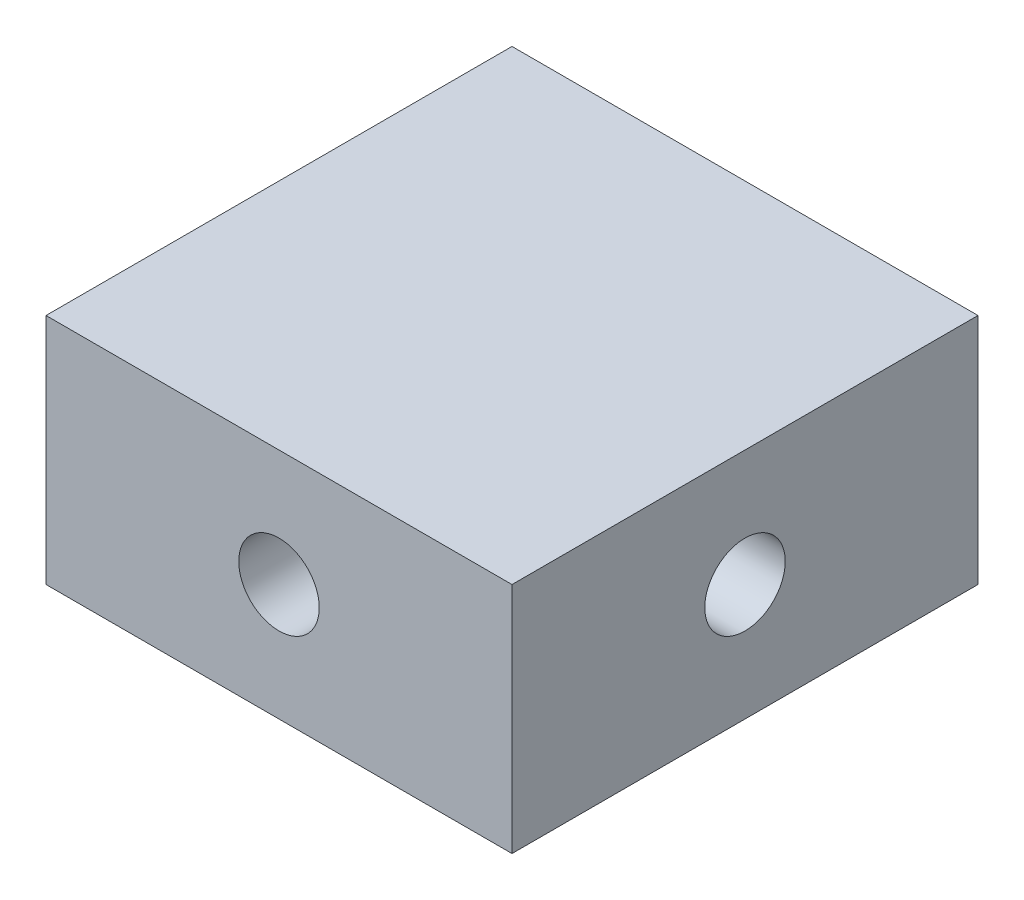
ISO-10303-21;
HEADER;
FILE_DESCRIPTION(('STEP AP214'),'2;1');
FILE_NAME('part.step','',(''),(''),'','','');
FILE_SCHEMA(('AUTOMOTIVE_DESIGN { 1 0 10303 214 1 1 1 1 }'));
ENDSEC;
DATA;
#1=APPLICATION_CONTEXT('core data for automotive mechanical design processes');
#2=APPLICATION_PROTOCOL_DEFINITION('international standard','automotive_design',2000,#1);
#3=PRODUCT_CONTEXT('',#1,'mechanical');
#4=PRODUCT('Part','Part','',(#3));
#5=PRODUCT_RELATED_PRODUCT_CATEGORY('part','',(#4));
#6=PRODUCT_DEFINITION_FORMATION('','',#4);
#7=PRODUCT_DEFINITION_CONTEXT('part definition',#1,'design');
#8=PRODUCT_DEFINITION('design','',#6,#7);
#9=PRODUCT_DEFINITION_SHAPE('','',#8);
#10=(LENGTH_UNIT() NAMED_UNIT(*) SI_UNIT(.MILLI.,.METRE.));
#11=(NAMED_UNIT(*) PLANE_ANGLE_UNIT() SI_UNIT($,.RADIAN.));
#12=(NAMED_UNIT(*) SI_UNIT($,.STERADIAN.) SOLID_ANGLE_UNIT());
#13=UNCERTAINTY_MEASURE_WITH_UNIT(LENGTH_MEASURE(1.E-05),#10,'distance_accuracy_value','');
#14=(GEOMETRIC_REPRESENTATION_CONTEXT(3) GLOBAL_UNCERTAINTY_ASSIGNED_CONTEXT((#13)) GLOBAL_UNIT_ASSIGNED_CONTEXT((#10,
#11,#12)) REPRESENTATION_CONTEXT('',''));
#15=CARTESIAN_POINT('',(0.,0.,0.));
#16=DIRECTION('',(0.,0.,1.));
#17=DIRECTION('',(1.,0.,0.));
#18=AXIS2_PLACEMENT_3D('',#15,#16,#17);
#19=CARTESIAN_POINT('',(0.,5.,10.));
#20=DIRECTION('',(0.,0.,-1.));
#21=DIRECTION('',(-1.,0.,0.));
#22=AXIS2_PLACEMENT_3D('',#19,#20,#21);
#23=PLANE('',#22);
#24=CARTESIAN_POINT('',(1.04744440165294E-13,0.,10.));
#25=DIRECTION('',(0.,0.,1.));
#26=DIRECTION('',(1.,0.,0.));
#27=AXIS2_PLACEMENT_3D('',#24,#25,#26);
#28=CIRCLE('',#27,1.7272);
#29=CARTESIAN_POINT('',(1.7272000000001,0.,10.));
#30=VERTEX_POINT('',#29);
#31=EDGE_CURVE('E124',#30,#30,#28,.T.);
#32=ORIENTED_EDGE('',*,*,#31,.F.);
#33=EDGE_LOOP('',(#32));
#34=FACE_BOUND('',#33,.T.);
#35=DIRECTION('',(1.,0.,0.));
#36=VECTOR('',#35,1.);
#37=CARTESIAN_POINT('',(0.,-5.,10.));
#38=LINE('',#37,#36);
#39=CARTESIAN_POINT('',(-10.,-5.,10.));
#40=VERTEX_POINT('',#39);
#41=CARTESIAN_POINT('',(10.,-5.,10.));
#42=VERTEX_POINT('',#41);
#43=EDGE_CURVE('E154',#40,#42,#38,.T.);
#44=ORIENTED_EDGE('',*,*,#43,.T.);
#45=DIRECTION('',(0.,-1.,0.));
#46=VECTOR('',#45,1.);
#47=CARTESIAN_POINT('',(10.,5.,10.));
#48=LINE('',#47,#46);
#49=CARTESIAN_POINT('',(10.,5.,10.));
#50=VERTEX_POINT('',#49);
#51=EDGE_CURVE('E11',#50,#42,#48,.T.);
#52=ORIENTED_EDGE('',*,*,#51,.F.);
#53=DIRECTION('',(1.,0.,0.));
#54=VECTOR('',#53,1.);
#55=CARTESIAN_POINT('',(0.,5.,10.));
#56=LINE('',#55,#54);
#57=CARTESIAN_POINT('',(-10.,5.,10.));
#58=VERTEX_POINT('',#57);
#59=EDGE_CURVE('E155',#58,#50,#56,.T.);
#60=ORIENTED_EDGE('',*,*,#59,.F.);
#61=DIRECTION('',(0.,-1.,0.));
#62=VECTOR('',#61,1.);
#63=CARTESIAN_POINT('',(-10.,5.,10.));
#64=LINE('',#63,#62);
#65=EDGE_CURVE('E64',#58,#40,#64,.T.);
#66=ORIENTED_EDGE('',*,*,#65,.T.);
#67=EDGE_LOOP('',(#44,#52,#60,#66));
#68=FACE_BOUND('',#67,.T.);
#69=ADVANCED_FACE('F44',(#34,#68),#23,.F.);
#70=CARTESIAN_POINT('',(10.,5.,0.));
#71=DIRECTION('',(-1.,0.,0.));
#72=DIRECTION('',(0.,0.,1.));
#73=AXIS2_PLACEMENT_3D('',#70,#71,#72);
#74=PLANE('',#73);
#75=CARTESIAN_POINT('',(10.,0.,0.));
#76=DIRECTION('',(1.,0.,0.));
#77=DIRECTION('',(0.,0.,-1.));
#78=AXIS2_PLACEMENT_3D('',#75,#76,#77);
#79=CIRCLE('',#78,1.7272);
#80=CARTESIAN_POINT('',(10.,0.,-1.7272));
#81=VERTEX_POINT('',#80);
#82=EDGE_CURVE('E146',#81,#81,#79,.T.);
#83=ORIENTED_EDGE('',*,*,#82,.F.);
#84=EDGE_LOOP('',(#83));
#85=FACE_BOUND('',#84,.T.);
#86=DIRECTION('',(0.,0.,-1.));
#87=VECTOR('',#86,1.);
#88=CARTESIAN_POINT('',(10.,-5.,0.));
#89=LINE('',#88,#87);
#90=CARTESIAN_POINT('',(10.,-5.,-10.));
#91=VERTEX_POINT('',#90);
#92=EDGE_CURVE('E169',#42,#91,#89,.T.);
#93=ORIENTED_EDGE('',*,*,#92,.T.);
#94=DIRECTION('',(0.,-1.,0.));
#95=VECTOR('',#94,1.);
#96=CARTESIAN_POINT('',(10.,5.,-10.));
#97=LINE('',#96,#95);
#98=CARTESIAN_POINT('',(10.,5.,-10.));
#99=VERTEX_POINT('',#98);
#100=EDGE_CURVE('E53',#99,#91,#97,.T.);
#101=ORIENTED_EDGE('',*,*,#100,.F.);
#102=DIRECTION('',(0.,0.,-1.));
#103=VECTOR('',#102,1.);
#104=CARTESIAN_POINT('',(10.,5.,0.));
#105=LINE('',#104,#103);
#106=EDGE_CURVE('E95',#50,#99,#105,.T.);
#107=ORIENTED_EDGE('',*,*,#106,.F.);
#108=ORIENTED_EDGE('',*,*,#51,.T.);
#109=EDGE_LOOP('',(#93,#101,#107,#108));
#110=FACE_BOUND('',#109,.T.);
#111=ADVANCED_FACE('F187',(#85,#110),#74,.F.);
#112=CARTESIAN_POINT('',(0.,5.,-10.));
#113=DIRECTION('',(0.,0.,-1.));
#114=DIRECTION('',(-1.,0.,0.));
#115=AXIS2_PLACEMENT_3D('',#112,#113,#114);
#116=PLANE('',#115);
#117=CARTESIAN_POINT('',(0.,0.,-10.));
#118=DIRECTION('',(0.,0.,-1.));
#119=DIRECTION('',(-1.,0.,0.));
#120=AXIS2_PLACEMENT_3D('',#117,#118,#119);
#121=CIRCLE('',#120,1.7272);
#122=CARTESIAN_POINT('',(-1.72720000000003,0.,-10.));
#123=VERTEX_POINT('',#122);
#124=EDGE_CURVE('E138',#123,#123,#121,.T.);
#125=ORIENTED_EDGE('',*,*,#124,.F.);
#126=EDGE_LOOP('',(#125));
#127=FACE_BOUND('',#126,.T.);
#128=DIRECTION('',(1.,0.,0.));
#129=VECTOR('',#128,1.);
#130=CARTESIAN_POINT('',(0.,-5.,-10.));
#131=LINE('',#130,#129);
#132=CARTESIAN_POINT('',(-10.,-5.,-10.));
#133=VERTEX_POINT('',#132);
#134=EDGE_CURVE('E173',#133,#91,#131,.T.);
#135=ORIENTED_EDGE('',*,*,#134,.F.);
#136=DIRECTION('',(0.,-1.,0.));
#137=VECTOR('',#136,1.);
#138=CARTESIAN_POINT('',(-10.,5.,-10.));
#139=LINE('',#138,#137);
#140=CARTESIAN_POINT('',(-10.,5.,-10.));
#141=VERTEX_POINT('',#140);
#142=EDGE_CURVE('E84',#141,#133,#139,.T.);
#143=ORIENTED_EDGE('',*,*,#142,.F.);
#144=DIRECTION('',(1.,0.,0.));
#145=VECTOR('',#144,1.);
#146=CARTESIAN_POINT('',(0.,5.,-10.));
#147=LINE('',#146,#145);
#148=EDGE_CURVE('E161',#141,#99,#147,.T.);
#149=ORIENTED_EDGE('',*,*,#148,.T.);
#150=ORIENTED_EDGE('',*,*,#100,.T.);
#151=EDGE_LOOP('',(#135,#143,#149,#150));
#152=FACE_BOUND('',#151,.T.);
#153=ADVANCED_FACE('F185',(#127,#152),#116,.T.);
#154=CARTESIAN_POINT('',(-10.,5.,0.));
#155=DIRECTION('',(-1.,0.,0.));
#156=DIRECTION('',(0.,0.,1.));
#157=AXIS2_PLACEMENT_3D('',#154,#155,#156);
#158=PLANE('',#157);
#159=CARTESIAN_POINT('',(-10.,0.,0.));
#160=DIRECTION('',(-1.,0.,0.));
#161=DIRECTION('',(0.,0.,1.));
#162=AXIS2_PLACEMENT_3D('',#159,#160,#161);
#163=CIRCLE('',#162,1.7272);
#164=CARTESIAN_POINT('',(-10.,0.,1.7272));
#165=VERTEX_POINT('',#164);
#166=EDGE_CURVE('E123',#165,#165,#163,.T.);
#167=ORIENTED_EDGE('',*,*,#166,.F.);
#168=EDGE_LOOP('',(#167));
#169=FACE_BOUND('',#168,.T.);
#170=DIRECTION('',(0.,0.,-1.));
#171=VECTOR('',#170,1.);
#172=CARTESIAN_POINT('',(-10.,-5.,0.));
#173=LINE('',#172,#171);
#174=EDGE_CURVE('E158',#40,#133,#173,.T.);
#175=ORIENTED_EDGE('',*,*,#174,.F.);
#176=ORIENTED_EDGE('',*,*,#65,.F.);
#177=DIRECTION('',(0.,0.,-1.));
#178=VECTOR('',#177,1.);
#179=CARTESIAN_POINT('',(-10.,5.,0.));
#180=LINE('',#179,#178);
#181=EDGE_CURVE('E165',#58,#141,#180,.T.);
#182=ORIENTED_EDGE('',*,*,#181,.T.);
#183=ORIENTED_EDGE('',*,*,#142,.T.);
#184=EDGE_LOOP('',(#175,#176,#182,#183));
#185=FACE_BOUND('',#184,.T.);
#186=ADVANCED_FACE('F191',(#169,#185),#158,.T.);
#187=CARTESIAN_POINT('',(0.,5.,0.));
#188=DIRECTION('',(0.,1.,0.));
#189=DIRECTION('',(0.,0.,1.));
#190=AXIS2_PLACEMENT_3D('',#187,#188,#189);
#191=PLANE('',#190);
#192=ORIENTED_EDGE('',*,*,#59,.T.);
#193=ORIENTED_EDGE('',*,*,#106,.T.);
#194=ORIENTED_EDGE('',*,*,#148,.F.);
#195=ORIENTED_EDGE('',*,*,#181,.F.);
#196=EDGE_LOOP('',(#192,#193,#194,#195));
#197=FACE_BOUND('',#196,.T.);
#198=ADVANCED_FACE('F193',(#197),#191,.T.);
#199=CARTESIAN_POINT('',(0.,-5.,0.));
#200=DIRECTION('',(0.,1.,0.));
#201=DIRECTION('',(0.,0.,1.));
#202=AXIS2_PLACEMENT_3D('',#199,#200,#201);
#203=PLANE('',#202);
#204=ORIENTED_EDGE('',*,*,#43,.F.);
#205=ORIENTED_EDGE('',*,*,#174,.T.);
#206=ORIENTED_EDGE('',*,*,#134,.T.);
#207=ORIENTED_EDGE('',*,*,#92,.F.);
#208=EDGE_LOOP('',(#204,#205,#206,#207));
#209=FACE_BOUND('',#208,.T.);
#210=ADVANCED_FACE('F190',(#209),#203,.F.);
#211=CARTESIAN_POINT('',(3.65,0.,0.));
#212=DIRECTION('',(1.,0.,0.));
#213=DIRECTION('',(0.,0.,-1.));
#214=AXIS2_PLACEMENT_3D('',#211,#212,#213);
#215=CONICAL_SURFACE('',#214,1.7272,1.02974425867665);
#216=CARTESIAN_POINT('',(2.6121935388156,0.,0.));
#217=VERTEX_POINT('',#216);
#218=VERTEX_LOOP('',#217);
#219=FACE_BOUND('',#218,.T.);
#220=CARTESIAN_POINT('',(3.65,0.,0.));
#221=DIRECTION('',(1.,0.,0.));
#222=DIRECTION('',(0.,0.,-1.));
#223=AXIS2_PLACEMENT_3D('',#220,#221,#222);
#224=CIRCLE('',#223,1.7272);
#225=CARTESIAN_POINT('',(3.65,0.,-1.7272));
#226=VERTEX_POINT('',#225);
#227=EDGE_CURVE('E150',#226,#226,#224,.T.);
#228=ORIENTED_EDGE('',*,*,#227,.T.);
#229=EDGE_LOOP('',(#228));
#230=FACE_BOUND('',#229,.T.);
#231=ADVANCED_FACE('F238',(#219,#230),#215,.F.);
#232=CARTESIAN_POINT('',(10.,0.,0.));
#233=DIRECTION('',(1.,0.,0.));
#234=DIRECTION('',(0.,0.,-1.));
#235=AXIS2_PLACEMENT_3D('',#232,#233,#234);
#236=CYLINDRICAL_SURFACE('',#235,1.7272);
#237=ORIENTED_EDGE('',*,*,#227,.F.);
#238=EDGE_LOOP('',(#237));
#239=FACE_BOUND('',#238,.T.);
#240=ORIENTED_EDGE('',*,*,#82,.T.);
#241=EDGE_LOOP('',(#240));
#242=FACE_BOUND('',#241,.T.);
#243=ADVANCED_FACE('F234',(#239,#242),#236,.F.);
#244=CARTESIAN_POINT('',(0.,0.,-3.65));
#245=DIRECTION('',(0.,0.,-1.));
#246=DIRECTION('',(-1.,0.,0.));
#247=AXIS2_PLACEMENT_3D('',#244,#245,#246);
#248=CONICAL_SURFACE('',#247,1.7272,1.02974425867665);
#249=CARTESIAN_POINT('',(0.,0.,-2.6121935388156));
#250=VERTEX_POINT('',#249);
#251=VERTEX_LOOP('',#250);
#252=FACE_BOUND('',#251,.T.);
#253=CARTESIAN_POINT('',(0.,0.,-3.65));
#254=DIRECTION('',(0.,0.,-1.));
#255=DIRECTION('',(-1.,0.,0.));
#256=AXIS2_PLACEMENT_3D('',#253,#254,#255);
#257=CIRCLE('',#256,1.7272);
#258=CARTESIAN_POINT('',(-1.72720000000003,0.,-3.65));
#259=VERTEX_POINT('',#258);
#260=EDGE_CURVE('E142',#259,#259,#257,.T.);
#261=ORIENTED_EDGE('',*,*,#260,.T.);
#262=EDGE_LOOP('',(#261));
#263=FACE_BOUND('',#262,.T.);
#264=ADVANCED_FACE('F230',(#252,#263),#248,.F.);
#265=CARTESIAN_POINT('',(0.,0.,-10.));
#266=DIRECTION('',(0.,0.,-1.));
#267=DIRECTION('',(-1.,0.,0.));
#268=AXIS2_PLACEMENT_3D('',#265,#266,#267);
#269=CYLINDRICAL_SURFACE('',#268,1.7272);
#270=ORIENTED_EDGE('',*,*,#260,.F.);
#271=EDGE_LOOP('',(#270));
#272=FACE_BOUND('',#271,.T.);
#273=ORIENTED_EDGE('',*,*,#124,.T.);
#274=EDGE_LOOP('',(#273));
#275=FACE_BOUND('',#274,.T.);
#276=ADVANCED_FACE('F226',(#272,#275),#269,.F.);
#277=CARTESIAN_POINT('',(-3.65,0.,0.));
#278=DIRECTION('',(-1.,0.,0.));
#279=DIRECTION('',(0.,0.,1.));
#280=AXIS2_PLACEMENT_3D('',#277,#278,#279);
#281=CONICAL_SURFACE('',#280,1.7272,1.02974425867665);
#282=CARTESIAN_POINT('',(-2.6121935388156,0.,0.));
#283=VERTEX_POINT('',#282);
#284=VERTEX_LOOP('',#283);
#285=FACE_BOUND('',#284,.T.);
#286=CARTESIAN_POINT('',(-3.65,0.,0.));
#287=DIRECTION('',(-1.,0.,0.));
#288=DIRECTION('',(0.,0.,1.));
#289=AXIS2_PLACEMENT_3D('',#286,#287,#288);
#290=CIRCLE('',#289,1.7272);
#291=CARTESIAN_POINT('',(-3.65,0.,1.7272));
#292=VERTEX_POINT('',#291);
#293=EDGE_CURVE('E129',#292,#292,#290,.T.);
#294=ORIENTED_EDGE('',*,*,#293,.T.);
#295=EDGE_LOOP('',(#294));
#296=FACE_BOUND('',#295,.T.);
#297=ADVANCED_FACE('F222',(#285,#296),#281,.F.);
#298=CARTESIAN_POINT('',(-10.,0.,0.));
#299=DIRECTION('',(-1.,0.,0.));
#300=DIRECTION('',(0.,0.,1.));
#301=AXIS2_PLACEMENT_3D('',#298,#299,#300);
#302=CYLINDRICAL_SURFACE('',#301,1.7272);
#303=ORIENTED_EDGE('',*,*,#293,.F.);
#304=EDGE_LOOP('',(#303));
#305=FACE_BOUND('',#304,.T.);
#306=ORIENTED_EDGE('',*,*,#166,.T.);
#307=EDGE_LOOP('',(#306));
#308=FACE_BOUND('',#307,.T.);
#309=ADVANCED_FACE('F116',(#305,#308),#302,.F.);
#310=CARTESIAN_POINT('',(1.04744440165294E-13,0.,3.65));
#311=DIRECTION('',(0.,0.,1.));
#312=DIRECTION('',(1.,0.,0.));
#313=AXIS2_PLACEMENT_3D('',#310,#311,#312);
#314=CONICAL_SURFACE('',#313,1.7272,1.02974425867665);
#315=CARTESIAN_POINT('',(1.02934949458212E-13,0.,2.6121935388156));
#316=VERTEX_POINT('',#315);
#317=VERTEX_LOOP('',#316);
#318=FACE_BOUND('',#317,.T.);
#319=CARTESIAN_POINT('',(1.04744440165294E-13,0.,3.65));
#320=DIRECTION('',(0.,0.,1.));
#321=DIRECTION('',(1.,0.,0.));
#322=AXIS2_PLACEMENT_3D('',#319,#320,#321);
#323=CIRCLE('',#322,1.7272);
#324=CARTESIAN_POINT('',(1.7272000000001,0.,3.65));
#325=VERTEX_POINT('',#324);
#326=EDGE_CURVE('E120',#325,#325,#323,.T.);
#327=ORIENTED_EDGE('',*,*,#326,.T.);
#328=EDGE_LOOP('',(#327));
#329=FACE_BOUND('',#328,.T.);
#330=ADVANCED_FACE('F112',(#318,#329),#314,.F.);
#331=CARTESIAN_POINT('',(1.04744440165294E-13,0.,10.));
#332=DIRECTION('',(0.,0.,1.));
#333=DIRECTION('',(1.,0.,0.));
#334=AXIS2_PLACEMENT_3D('',#331,#332,#333);
#335=CYLINDRICAL_SURFACE('',#334,1.7272);
#336=ORIENTED_EDGE('',*,*,#326,.F.);
#337=EDGE_LOOP('',(#336));
#338=FACE_BOUND('',#337,.T.);
#339=ORIENTED_EDGE('',*,*,#31,.T.);
#340=EDGE_LOOP('',(#339));
#341=FACE_BOUND('',#340,.T.);
#342=ADVANCED_FACE('F115',(#338,#341),#335,.F.);
#343=CLOSED_SHELL('',(#69,#111,#153,#186,#198,#210,#231,#243,#264,#276,#297,#309,#330,#342));
#344=MANIFOLD_SOLID_BREP('B2',#343);
#345=ADVANCED_BREP_SHAPE_REPRESENTATION('',(#18,#344),#14);
#346=SHAPE_DEFINITION_REPRESENTATION(#9,#345);
ENDSEC;
END-ISO-10303-21;
